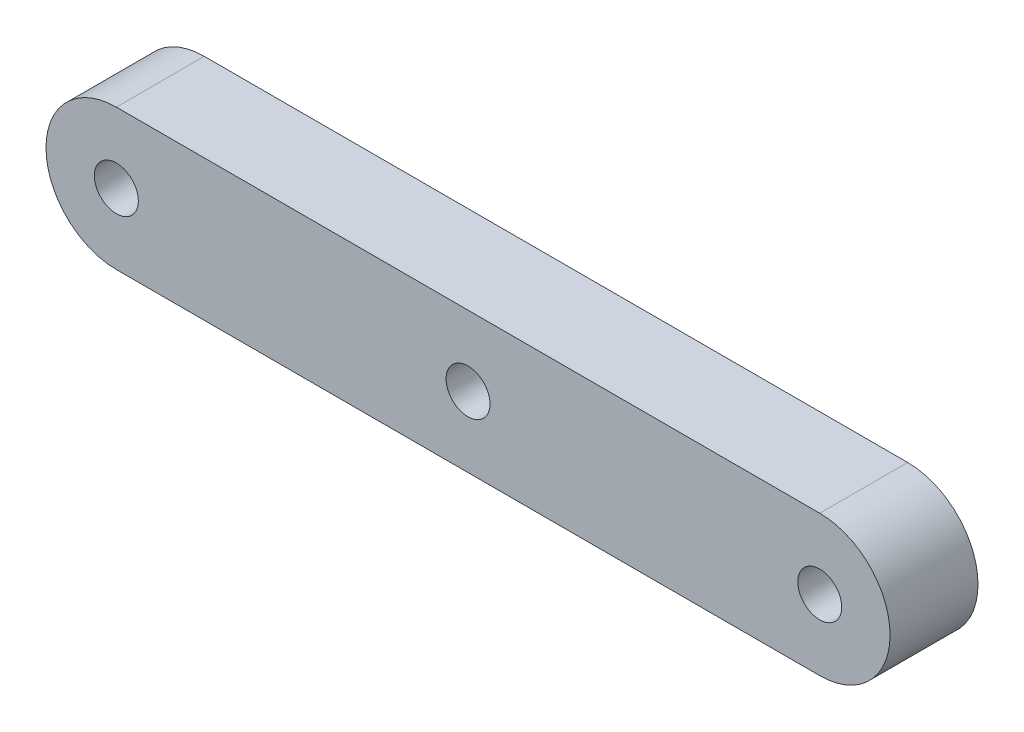
ISO-10303-21;
HEADER;
FILE_DESCRIPTION(('STEP AP214'),'2;1');
FILE_NAME('part.step','',(''),(''),'','','');
FILE_SCHEMA(('AUTOMOTIVE_DESIGN { 1 0 10303 214 1 1 1 1 }'));
ENDSEC;
DATA;
#1=APPLICATION_CONTEXT('core data for automotive mechanical design processes');
#2=APPLICATION_PROTOCOL_DEFINITION('international standard','automotive_design',2000,#1);
#3=PRODUCT_CONTEXT('',#1,'mechanical');
#4=PRODUCT('Part','Part','',(#3));
#5=PRODUCT_RELATED_PRODUCT_CATEGORY('part','',(#4));
#6=PRODUCT_DEFINITION_FORMATION('','',#4);
#7=PRODUCT_DEFINITION_CONTEXT('part definition',#1,'design');
#8=PRODUCT_DEFINITION('design','',#6,#7);
#9=PRODUCT_DEFINITION_SHAPE('','',#8);
#10=(LENGTH_UNIT() NAMED_UNIT(*) SI_UNIT(.MILLI.,.METRE.));
#11=(NAMED_UNIT(*) PLANE_ANGLE_UNIT() SI_UNIT($,.RADIAN.));
#12=(NAMED_UNIT(*) SI_UNIT($,.STERADIAN.) SOLID_ANGLE_UNIT());
#13=UNCERTAINTY_MEASURE_WITH_UNIT(LENGTH_MEASURE(1.E-05),#10,'distance_accuracy_value','');
#14=(GEOMETRIC_REPRESENTATION_CONTEXT(3) GLOBAL_UNCERTAINTY_ASSIGNED_CONTEXT((#13)) GLOBAL_UNIT_ASSIGNED_CONTEXT((#10,
#11,#12)) REPRESENTATION_CONTEXT('',''));
#15=CARTESIAN_POINT('',(0.,0.,0.));
#16=DIRECTION('',(0.,0.,1.));
#17=DIRECTION('',(1.,0.,0.));
#18=AXIS2_PLACEMENT_3D('',#15,#16,#17);
#19=CARTESIAN_POINT('',(0.588618423098236,58.840344830129,12.7));
#20=DIRECTION('',(0.,0.,1.));
#21=DIRECTION('',(1.,0.,0.));
#22=AXIS2_PLACEMENT_3D('',#19,#20,#21);
#23=PLANE('',#22);
#24=CARTESIAN_POINT('',(51.3886184230982,58.840344830129,12.7));
#25=DIRECTION('',(0.,0.,1.));
#26=DIRECTION('',(1.,0.,0.));
#27=AXIS2_PLACEMENT_3D('',#24,#25,#26);
#28=CIRCLE('',#27,3.175);
#29=CARTESIAN_POINT('',(54.5636184230982,58.840344830129,12.7));
#30=VERTEX_POINT('',#29);
#31=EDGE_CURVE('E114',#30,#30,#28,.T.);
#32=ORIENTED_EDGE('',*,*,#31,.F.);
#33=EDGE_LOOP('',(#32));
#34=FACE_BOUND('',#33,.T.);
#35=CARTESIAN_POINT('',(0.588618423098236,58.840344830129,12.7));
#36=DIRECTION('',(0.,0.,1.));
#37=DIRECTION('',(1.,0.,0.));
#38=AXIS2_PLACEMENT_3D('',#35,#36,#37);
#39=CIRCLE('',#38,10.16);
#40=CARTESIAN_POINT('',(0.588618423098236,69.000344830129,12.7));
#41=VERTEX_POINT('',#40);
#42=CARTESIAN_POINT('',(0.588618423098236,48.680344830129,12.7));
#43=VERTEX_POINT('',#42);
#44=EDGE_CURVE('E84',#41,#43,#39,.T.);
#45=ORIENTED_EDGE('',*,*,#44,.T.);
#46=DIRECTION('',(1.,0.,0.));
#47=VECTOR('',#46,1.);
#48=CARTESIAN_POINT('',(0.588618423098236,48.680344830129,12.7));
#49=LINE('',#48,#47);
#50=CARTESIAN_POINT('',(102.188618423098,48.680344830129,12.7));
#51=VERTEX_POINT('',#50);
#52=EDGE_CURVE('E79',#43,#51,#49,.T.);
#53=ORIENTED_EDGE('',*,*,#52,.T.);
#54=CARTESIAN_POINT('',(102.188618423098,58.840344830129,12.7));
#55=DIRECTION('',(0.,0.,1.));
#56=DIRECTION('',(1.,0.,0.));
#57=AXIS2_PLACEMENT_3D('',#54,#55,#56);
#58=CIRCLE('',#57,10.16);
#59=CARTESIAN_POINT('',(102.188618423098,69.000344830129,12.7));
#60=VERTEX_POINT('',#59);
#61=EDGE_CURVE('E82',#51,#60,#58,.T.);
#62=ORIENTED_EDGE('',*,*,#61,.T.);
#63=DIRECTION('',(-1.,0.,0.));
#64=VECTOR('',#63,1.);
#65=CARTESIAN_POINT('',(0.588618423098236,69.000344830129,12.7));
#66=LINE('',#65,#64);
#67=EDGE_CURVE('E49',#60,#41,#66,.T.);
#68=ORIENTED_EDGE('',*,*,#67,.T.);
#69=EDGE_LOOP('',(#45,#53,#62,#68));
#70=FACE_BOUND('',#69,.T.);
#71=CARTESIAN_POINT('',(0.588618423098236,58.840344830129,12.7));
#72=DIRECTION('',(0.,0.,1.));
#73=DIRECTION('',(1.,0.,0.));
#74=AXIS2_PLACEMENT_3D('',#71,#72,#73);
#75=CIRCLE('',#74,3.175);
#76=CARTESIAN_POINT('',(3.76361842309823,58.840344830129,12.7));
#77=VERTEX_POINT('',#76);
#78=EDGE_CURVE('E99',#77,#77,#75,.T.);
#79=ORIENTED_EDGE('',*,*,#78,.F.);
#80=EDGE_LOOP('',(#79));
#81=FACE_BOUND('',#80,.T.);
#82=CARTESIAN_POINT('',(102.188618423098,58.840344830129,12.7));
#83=DIRECTION('',(0.,0.,1.));
#84=DIRECTION('',(1.,0.,0.));
#85=AXIS2_PLACEMENT_3D('',#82,#83,#84);
#86=CIRCLE('',#85,3.175);
#87=CARTESIAN_POINT('',(105.363618423098,58.840344830129,12.7));
#88=VERTEX_POINT('',#87);
#89=EDGE_CURVE('E120',#88,#88,#86,.T.);
#90=ORIENTED_EDGE('',*,*,#89,.F.);
#91=EDGE_LOOP('',(#90));
#92=FACE_BOUND('',#91,.T.);
#93=ADVANCED_FACE('F32',(#34,#70,#81,#92),#23,.T.);
#94=CARTESIAN_POINT('',(0.588618423098236,58.840344830129,0.));
#95=DIRECTION('',(0.,0.,1.));
#96=DIRECTION('',(1.,0.,0.));
#97=AXIS2_PLACEMENT_3D('',#94,#95,#96);
#98=PLANE('',#97);
#99=CARTESIAN_POINT('',(0.588618423098236,58.840344830129,0.));
#100=DIRECTION('',(0.,0.,1.));
#101=DIRECTION('',(1.,0.,0.));
#102=AXIS2_PLACEMENT_3D('',#99,#100,#101);
#103=CIRCLE('',#102,10.16);
#104=CARTESIAN_POINT('',(0.588618423098236,69.000344830129,0.));
#105=VERTEX_POINT('',#104);
#106=CARTESIAN_POINT('',(0.588618423098236,48.680344830129,0.));
#107=VERTEX_POINT('',#106);
#108=EDGE_CURVE('E96',#105,#107,#103,.T.);
#109=ORIENTED_EDGE('',*,*,#108,.F.);
#110=DIRECTION('',(-1.,0.,0.));
#111=VECTOR('',#110,1.);
#112=CARTESIAN_POINT('',(0.588618423098236,69.000344830129,0.));
#113=LINE('',#112,#111);
#114=CARTESIAN_POINT('',(102.188618423098,69.000344830129,0.));
#115=VERTEX_POINT('',#114);
#116=EDGE_CURVE('E72',#115,#105,#113,.T.);
#117=ORIENTED_EDGE('',*,*,#116,.F.);
#118=CARTESIAN_POINT('',(102.188618423098,58.840344830129,0.));
#119=DIRECTION('',(0.,0.,1.));
#120=DIRECTION('',(1.,0.,0.));
#121=AXIS2_PLACEMENT_3D('',#118,#119,#120);
#122=CIRCLE('',#121,10.16);
#123=CARTESIAN_POINT('',(102.188618423098,48.680344830129,0.));
#124=VERTEX_POINT('',#123);
#125=EDGE_CURVE('E66',#124,#115,#122,.T.);
#126=ORIENTED_EDGE('',*,*,#125,.F.);
#127=DIRECTION('',(1.,0.,0.));
#128=VECTOR('',#127,1.);
#129=CARTESIAN_POINT('',(0.588618423098236,48.680344830129,0.));
#130=LINE('',#129,#128);
#131=EDGE_CURVE('E88',#107,#124,#130,.T.);
#132=ORIENTED_EDGE('',*,*,#131,.F.);
#133=EDGE_LOOP('',(#109,#117,#126,#132));
#134=FACE_BOUND('',#133,.T.);
#135=CARTESIAN_POINT('',(0.588618423098236,58.840344830129,0.));
#136=DIRECTION('',(0.,0.,1.));
#137=DIRECTION('',(1.,0.,0.));
#138=AXIS2_PLACEMENT_3D('',#135,#136,#137);
#139=CIRCLE('',#138,3.175);
#140=CARTESIAN_POINT('',(3.76361842309823,58.840344830129,0.));
#141=VERTEX_POINT('',#140);
#142=EDGE_CURVE('E111',#141,#141,#139,.T.);
#143=ORIENTED_EDGE('',*,*,#142,.T.);
#144=EDGE_LOOP('',(#143));
#145=FACE_BOUND('',#144,.T.);
#146=CARTESIAN_POINT('',(51.3886184230982,58.840344830129,0.));
#147=DIRECTION('',(0.,0.,1.));
#148=DIRECTION('',(1.,0.,0.));
#149=AXIS2_PLACEMENT_3D('',#146,#147,#148);
#150=CIRCLE('',#149,3.175);
#151=CARTESIAN_POINT('',(54.5636184230982,58.840344830129,0.));
#152=VERTEX_POINT('',#151);
#153=EDGE_CURVE('E117',#152,#152,#150,.T.);
#154=ORIENTED_EDGE('',*,*,#153,.T.);
#155=EDGE_LOOP('',(#154));
#156=FACE_BOUND('',#155,.T.);
#157=CARTESIAN_POINT('',(102.188618423098,58.840344830129,0.));
#158=DIRECTION('',(0.,0.,1.));
#159=DIRECTION('',(1.,0.,0.));
#160=AXIS2_PLACEMENT_3D('',#157,#158,#159);
#161=CIRCLE('',#160,3.175);
#162=CARTESIAN_POINT('',(105.363618423098,58.840344830129,0.));
#163=VERTEX_POINT('',#162);
#164=EDGE_CURVE('E123',#163,#163,#161,.T.);
#165=ORIENTED_EDGE('',*,*,#164,.T.);
#166=EDGE_LOOP('',(#165));
#167=FACE_BOUND('',#166,.T.);
#168=ADVANCED_FACE('F107',(#134,#145,#156,#167),#98,.F.);
#169=CARTESIAN_POINT('',(0.588618423098236,58.840344830129,12.7));
#170=DIRECTION('',(0.,0.,-1.));
#171=DIRECTION('',(-1.,0.,0.));
#172=AXIS2_PLACEMENT_3D('',#169,#170,#171);
#173=CYLINDRICAL_SURFACE('',#172,10.16);
#174=ORIENTED_EDGE('',*,*,#108,.T.);
#175=DIRECTION('',(0.,0.,-1.));
#176=VECTOR('',#175,1.);
#177=CARTESIAN_POINT('',(0.588618423098236,48.680344830129,12.7));
#178=LINE('',#177,#176);
#179=EDGE_CURVE('E11',#43,#107,#178,.T.);
#180=ORIENTED_EDGE('',*,*,#179,.F.);
#181=ORIENTED_EDGE('',*,*,#44,.F.);
#182=DIRECTION('',(0.,0.,-1.));
#183=VECTOR('',#182,1.);
#184=CARTESIAN_POINT('',(0.588618423098236,69.000344830129,12.7));
#185=LINE('',#184,#183);
#186=EDGE_CURVE('E92',#41,#105,#185,.T.);
#187=ORIENTED_EDGE('',*,*,#186,.T.);
#188=EDGE_LOOP('',(#174,#180,#181,#187));
#189=FACE_BOUND('',#188,.T.);
#190=ADVANCED_FACE('F34',(#189),#173,.T.);
#191=CARTESIAN_POINT('',(0.588618423098236,48.680344830129,12.7));
#192=DIRECTION('',(0.,1.,0.));
#193=DIRECTION('',(-1.,0.,0.));
#194=AXIS2_PLACEMENT_3D('',#191,#192,#193);
#195=PLANE('',#194);
#196=ORIENTED_EDGE('',*,*,#131,.T.);
#197=DIRECTION('',(0.,0.,-1.));
#198=VECTOR('',#197,1.);
#199=CARTESIAN_POINT('',(102.188618423098,48.680344830129,12.7));
#200=LINE('',#199,#198);
#201=EDGE_CURVE('E41',#51,#124,#200,.T.);
#202=ORIENTED_EDGE('',*,*,#201,.F.);
#203=ORIENTED_EDGE('',*,*,#52,.F.);
#204=ORIENTED_EDGE('',*,*,#179,.T.);
#205=EDGE_LOOP('',(#196,#202,#203,#204));
#206=FACE_BOUND('',#205,.T.);
#207=ADVANCED_FACE('F87',(#206),#195,.F.);
#208=CARTESIAN_POINT('',(102.188618423098,58.840344830129,12.7));
#209=DIRECTION('',(0.,0.,-1.));
#210=DIRECTION('',(-1.,0.,0.));
#211=AXIS2_PLACEMENT_3D('',#208,#209,#210);
#212=CYLINDRICAL_SURFACE('',#211,10.16);
#213=ORIENTED_EDGE('',*,*,#125,.T.);
#214=DIRECTION('',(0.,0.,-1.));
#215=VECTOR('',#214,1.);
#216=CARTESIAN_POINT('',(102.188618423098,69.000344830129,12.7));
#217=LINE('',#216,#215);
#218=EDGE_CURVE('E89',#60,#115,#217,.T.);
#219=ORIENTED_EDGE('',*,*,#218,.F.);
#220=ORIENTED_EDGE('',*,*,#61,.F.);
#221=ORIENTED_EDGE('',*,*,#201,.T.);
#222=EDGE_LOOP('',(#213,#219,#220,#221));
#223=FACE_BOUND('',#222,.T.);
#224=ADVANCED_FACE('F90',(#223),#212,.T.);
#225=CARTESIAN_POINT('',(0.588618423098236,69.000344830129,12.7));
#226=DIRECTION('',(0.,-1.,0.));
#227=DIRECTION('',(1.,0.,0.));
#228=AXIS2_PLACEMENT_3D('',#225,#226,#227);
#229=PLANE('',#228);
#230=ORIENTED_EDGE('',*,*,#116,.T.);
#231=ORIENTED_EDGE('',*,*,#186,.F.);
#232=ORIENTED_EDGE('',*,*,#67,.F.);
#233=ORIENTED_EDGE('',*,*,#218,.T.);
#234=EDGE_LOOP('',(#230,#231,#232,#233));
#235=FACE_BOUND('',#234,.T.);
#236=ADVANCED_FACE('F104',(#235),#229,.F.);
#237=CARTESIAN_POINT('',(0.588618423098236,58.840344830129,12.7));
#238=DIRECTION('',(0.,0.,-1.));
#239=DIRECTION('',(-1.,0.,0.));
#240=AXIS2_PLACEMENT_3D('',#237,#238,#239);
#241=CYLINDRICAL_SURFACE('',#240,3.175);
#242=ORIENTED_EDGE('',*,*,#78,.T.);
#243=EDGE_LOOP('',(#242));
#244=FACE_BOUND('',#243,.T.);
#245=ORIENTED_EDGE('',*,*,#142,.F.);
#246=EDGE_LOOP('',(#245));
#247=FACE_BOUND('',#246,.T.);
#248=ADVANCED_FACE('F141',(#244,#247),#241,.F.);
#249=CARTESIAN_POINT('',(51.3886184230982,58.840344830129,12.7));
#250=DIRECTION('',(0.,0.,-1.));
#251=DIRECTION('',(-1.,0.,0.));
#252=AXIS2_PLACEMENT_3D('',#249,#250,#251);
#253=CYLINDRICAL_SURFACE('',#252,3.175);
#254=ORIENTED_EDGE('',*,*,#31,.T.);
#255=EDGE_LOOP('',(#254));
#256=FACE_BOUND('',#255,.T.);
#257=ORIENTED_EDGE('',*,*,#153,.F.);
#258=EDGE_LOOP('',(#257));
#259=FACE_BOUND('',#258,.T.);
#260=ADVANCED_FACE('F187',(#256,#259),#253,.F.);
#261=CARTESIAN_POINT('',(102.188618423098,58.840344830129,12.7));
#262=DIRECTION('',(0.,0.,-1.));
#263=DIRECTION('',(-1.,0.,0.));
#264=AXIS2_PLACEMENT_3D('',#261,#262,#263);
#265=CYLINDRICAL_SURFACE('',#264,3.175);
#266=ORIENTED_EDGE('',*,*,#89,.T.);
#267=EDGE_LOOP('',(#266));
#268=FACE_BOUND('',#267,.T.);
#269=ORIENTED_EDGE('',*,*,#164,.F.);
#270=EDGE_LOOP('',(#269));
#271=FACE_BOUND('',#270,.T.);
#272=ADVANCED_FACE('F129',(#268,#271),#265,.F.);
#273=CLOSED_SHELL('',(#93,#168,#190,#207,#224,#236,#248,#260,#272));
#274=MANIFOLD_SOLID_BREP('B2',#273);
#275=ADVANCED_BREP_SHAPE_REPRESENTATION('',(#18,#274),#14);
#276=SHAPE_DEFINITION_REPRESENTATION(#9,#275);
ENDSEC;
END-ISO-10303-21;
